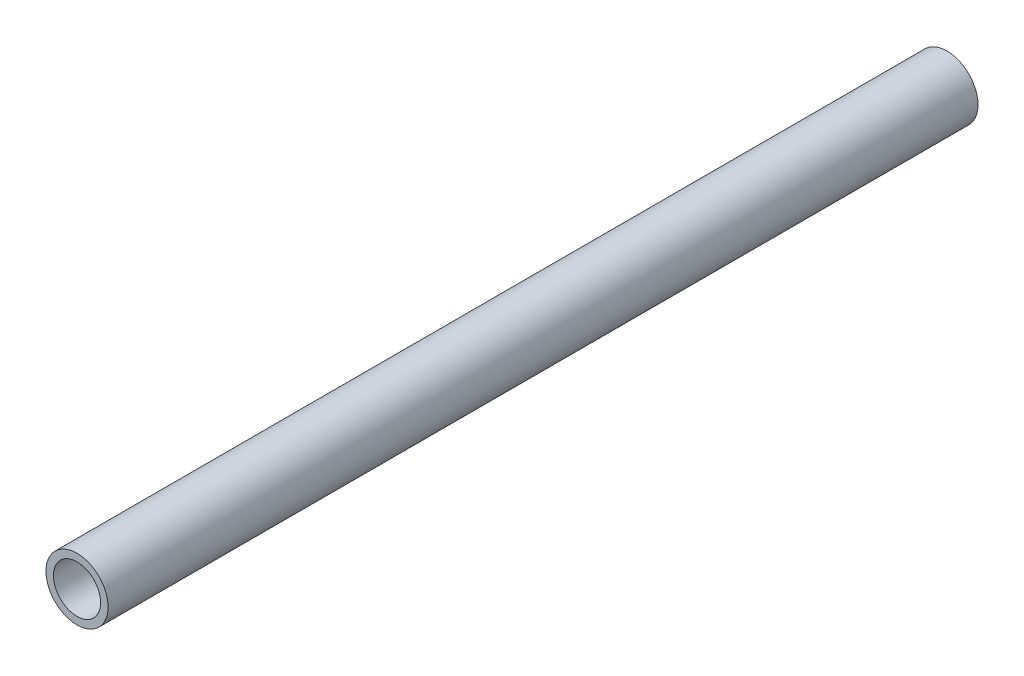
ISO-10303-21;
HEADER;
FILE_DESCRIPTION(('STEP AP214'),'2;1');
FILE_NAME('part.step','',(''),(''),'','','');
FILE_SCHEMA(('AUTOMOTIVE_DESIGN { 1 0 10303 214 1 1 1 1 }'));
ENDSEC;
DATA;
#1=APPLICATION_CONTEXT('core data for automotive mechanical design processes');
#2=APPLICATION_PROTOCOL_DEFINITION('international standard','automotive_design',2000,#1);
#3=PRODUCT_CONTEXT('',#1,'mechanical');
#4=PRODUCT('Part','Part','',(#3));
#5=PRODUCT_RELATED_PRODUCT_CATEGORY('part','',(#4));
#6=PRODUCT_DEFINITION_FORMATION('','',#4);
#7=PRODUCT_DEFINITION_CONTEXT('part definition',#1,'design');
#8=PRODUCT_DEFINITION('design','',#6,#7);
#9=PRODUCT_DEFINITION_SHAPE('','',#8);
#10=(LENGTH_UNIT() NAMED_UNIT(*) SI_UNIT(.MILLI.,.METRE.));
#11=(NAMED_UNIT(*) PLANE_ANGLE_UNIT() SI_UNIT($,.RADIAN.));
#12=(NAMED_UNIT(*) SI_UNIT($,.STERADIAN.) SOLID_ANGLE_UNIT());
#13=UNCERTAINTY_MEASURE_WITH_UNIT(LENGTH_MEASURE(1.E-05),#10,'distance_accuracy_value','');
#14=(GEOMETRIC_REPRESENTATION_CONTEXT(3) GLOBAL_UNCERTAINTY_ASSIGNED_CONTEXT((#13)) GLOBAL_UNIT_ASSIGNED_CONTEXT((#10,
#11,#12)) REPRESENTATION_CONTEXT('',''));
#15=CARTESIAN_POINT('',(0.,0.,0.));
#16=DIRECTION('',(0.,0.,1.));
#17=DIRECTION('',(1.,0.,0.));
#18=AXIS2_PLACEMENT_3D('',#15,#16,#17);
#19=CARTESIAN_POINT('',(0.,0.,175.));
#20=DIRECTION('',(0.,0.,1.));
#21=DIRECTION('',(1.,0.,0.));
#22=AXIS2_PLACEMENT_3D('',#19,#20,#21);
#23=PLANE('',#22);
#24=CARTESIAN_POINT('',(0.,0.,175.));
#25=DIRECTION('',(0.,0.,1.));
#26=DIRECTION('',(1.,0.,0.));
#27=AXIS2_PLACEMENT_3D('',#24,#25,#26);
#28=CIRCLE('',#27,12.5);
#29=CARTESIAN_POINT('',(12.5,0.,175.));
#30=VERTEX_POINT('',#29);
#31=EDGE_CURVE('E11',#30,#30,#28,.T.);
#32=ORIENTED_EDGE('',*,*,#31,.T.);
#33=EDGE_LOOP('',(#32));
#34=FACE_BOUND('',#33,.T.);
#35=CARTESIAN_POINT('',(0.,0.,175.));
#36=DIRECTION('',(0.,0.,1.));
#37=DIRECTION('',(1.,0.,0.));
#38=AXIS2_PLACEMENT_3D('',#35,#36,#37);
#39=CIRCLE('',#38,9.5);
#40=CARTESIAN_POINT('',(9.5,0.,175.));
#41=VERTEX_POINT('',#40);
#42=EDGE_CURVE('E50',#41,#41,#39,.T.);
#43=ORIENTED_EDGE('',*,*,#42,.F.);
#44=EDGE_LOOP('',(#43));
#45=FACE_BOUND('',#44,.T.);
#46=ADVANCED_FACE('F39',(#34,#45),#23,.T.);
#47=CARTESIAN_POINT('',(0.,0.,-175.));
#48=DIRECTION('',(0.,0.,1.));
#49=DIRECTION('',(1.,0.,0.));
#50=AXIS2_PLACEMENT_3D('',#47,#48,#49);
#51=PLANE('',#50);
#52=CARTESIAN_POINT('',(0.,0.,-175.));
#53=DIRECTION('',(0.,0.,1.));
#54=DIRECTION('',(1.,0.,0.));
#55=AXIS2_PLACEMENT_3D('',#52,#53,#54);
#56=CIRCLE('',#55,12.5);
#57=CARTESIAN_POINT('',(12.5,0.,-175.));
#58=VERTEX_POINT('',#57);
#59=EDGE_CURVE('E43',#58,#58,#56,.T.);
#60=ORIENTED_EDGE('',*,*,#59,.F.);
#61=EDGE_LOOP('',(#60));
#62=FACE_BOUND('',#61,.T.);
#63=CARTESIAN_POINT('',(0.,0.,-175.));
#64=DIRECTION('',(0.,0.,1.));
#65=DIRECTION('',(1.,0.,0.));
#66=AXIS2_PLACEMENT_3D('',#63,#64,#65);
#67=CIRCLE('',#66,9.5);
#68=CARTESIAN_POINT('',(9.5,0.,-175.));
#69=VERTEX_POINT('',#68);
#70=EDGE_CURVE('E52',#69,#69,#67,.T.);
#71=ORIENTED_EDGE('',*,*,#70,.T.);
#72=EDGE_LOOP('',(#71));
#73=FACE_BOUND('',#72,.T.);
#74=ADVANCED_FACE('F62',(#62,#73),#51,.F.);
#75=CARTESIAN_POINT('',(0.,0.,175.));
#76=DIRECTION('',(0.,0.,-1.));
#77=DIRECTION('',(-1.,0.,0.));
#78=AXIS2_PLACEMENT_3D('',#75,#76,#77);
#79=CYLINDRICAL_SURFACE('',#78,12.5);
#80=ORIENTED_EDGE('',*,*,#31,.F.);
#81=EDGE_LOOP('',(#80));
#82=FACE_BOUND('',#81,.T.);
#83=ORIENTED_EDGE('',*,*,#59,.T.);
#84=EDGE_LOOP('',(#83));
#85=FACE_BOUND('',#84,.T.);
#86=ADVANCED_FACE('F41',(#82,#85),#79,.T.);
#87=CARTESIAN_POINT('',(0.,0.,175.));
#88=DIRECTION('',(0.,0.,-1.));
#89=DIRECTION('',(-1.,0.,0.));
#90=AXIS2_PLACEMENT_3D('',#87,#88,#89);
#91=CYLINDRICAL_SURFACE('',#90,9.5);
#92=ORIENTED_EDGE('',*,*,#42,.T.);
#93=EDGE_LOOP('',(#92));
#94=FACE_BOUND('',#93,.T.);
#95=ORIENTED_EDGE('',*,*,#70,.F.);
#96=EDGE_LOOP('',(#95));
#97=FACE_BOUND('',#96,.T.);
#98=ADVANCED_FACE('F58',(#94,#97),#91,.F.);
#99=CLOSED_SHELL('',(#46,#74,#86,#98));
#100=MANIFOLD_SOLID_BREP('B2',#99);
#101=ADVANCED_BREP_SHAPE_REPRESENTATION('',(#18,#100),#14);
#102=SHAPE_DEFINITION_REPRESENTATION(#9,#101);
ENDSEC;
END-ISO-10303-21;
